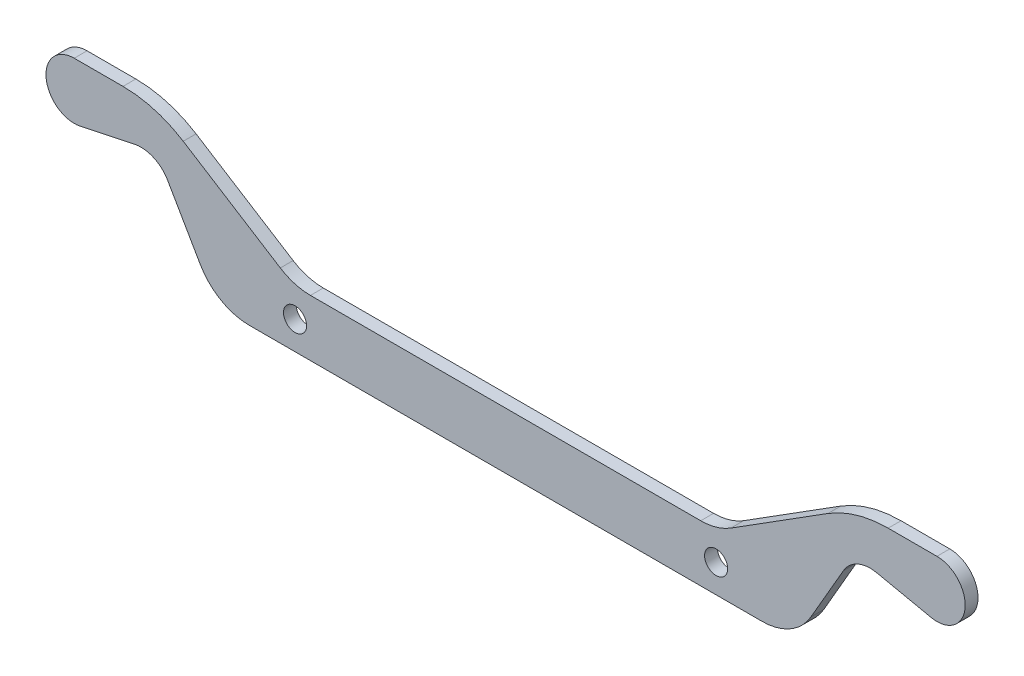
ISO-10303-21;
HEADER;
FILE_DESCRIPTION(('STEP AP214'),'2;1');
FILE_NAME('part.step','',(''),(''),'','','');
FILE_SCHEMA(('AUTOMOTIVE_DESIGN { 1 0 10303 214 1 1 1 1 }'));
ENDSEC;
DATA;
#1=APPLICATION_CONTEXT('core data for automotive mechanical design processes');
#2=APPLICATION_PROTOCOL_DEFINITION('international standard','automotive_design',2000,#1);
#3=PRODUCT_CONTEXT('',#1,'mechanical');
#4=PRODUCT('Part','Part','',(#3));
#5=PRODUCT_RELATED_PRODUCT_CATEGORY('part','',(#4));
#6=PRODUCT_DEFINITION_FORMATION('','',#4);
#7=PRODUCT_DEFINITION_CONTEXT('part definition',#1,'design');
#8=PRODUCT_DEFINITION('design','',#6,#7);
#9=PRODUCT_DEFINITION_SHAPE('','',#8);
#10=(LENGTH_UNIT() NAMED_UNIT(*) SI_UNIT(.MILLI.,.METRE.));
#11=(NAMED_UNIT(*) PLANE_ANGLE_UNIT() SI_UNIT($,.RADIAN.));
#12=(NAMED_UNIT(*) SI_UNIT($,.STERADIAN.) SOLID_ANGLE_UNIT());
#13=UNCERTAINTY_MEASURE_WITH_UNIT(LENGTH_MEASURE(1.E-05),#10,'distance_accuracy_value','');
#14=(GEOMETRIC_REPRESENTATION_CONTEXT(3) GLOBAL_UNCERTAINTY_ASSIGNED_CONTEXT((#13)) GLOBAL_UNIT_ASSIGNED_CONTEXT((#10,
#11,#12)) REPRESENTATION_CONTEXT('',''));
#15=CARTESIAN_POINT('',(0.,0.,0.));
#16=DIRECTION('',(0.,0.,1.));
#17=DIRECTION('',(1.,0.,0.));
#18=AXIS2_PLACEMENT_3D('',#15,#16,#17);
#19=CARTESIAN_POINT('',(-38.,22.,2.5));
#20=DIRECTION('',(0.,0.,1.));
#21=DIRECTION('',(1.,0.,0.));
#22=AXIS2_PLACEMENT_3D('',#19,#20,#21);
#23=PLANE('',#22);
#24=DIRECTION('',(1.,0.,0.));
#25=VECTOR('',#24,1.);
#26=CARTESIAN_POINT('',(0.,0.,2.5));
#27=LINE('',#26,#25);
#28=CARTESIAN_POINT('',(-49.9267151745786,0.,2.5));
#29=VERTEX_POINT('',#28);
#30=CARTESIAN_POINT('',(49.9267151745786,0.,2.5));
#31=VERTEX_POINT('',#30);
#32=EDGE_CURVE('E154',#29,#31,#27,.T.);
#33=ORIENTED_EDGE('',*,*,#32,.T.);
#34=CARTESIAN_POINT('',(49.9267151745787,11.,2.5));
#35=DIRECTION('',(0.,0.,-1.));
#36=DIRECTION('',(1.,0.,0.));
#37=AXIS2_PLACEMENT_3D('',#34,#35,#36);
#38=CIRCLE('',#37,11.);
#39=CARTESIAN_POINT('',(59.4529946162075,5.50000000000006,2.5));
#40=VERTEX_POINT('',#39);
#41=EDGE_CURVE('E307',#40,#31,#38,.T.);
#42=ORIENTED_EDGE('',*,*,#41,.F.);
#43=DIRECTION('',(-0.499999999999998,-0.86602540378444,0.));
#44=VECTOR('',#43,1.);
#45=CARTESIAN_POINT('',(59.4529946162075,5.50000000000006,2.5));
#46=LINE('',#45,#44);
#47=CARTESIAN_POINT('',(65.8038475772934,16.5,2.5));
#48=VERTEX_POINT('',#47);
#49=EDGE_CURVE('E349',#48,#40,#46,.T.);
#50=ORIENTED_EDGE('',*,*,#49,.F.);
#51=CARTESIAN_POINT('',(71.,13.5,2.5));
#52=DIRECTION('',(0.,0.,1.));
#53=DIRECTION('',(-1.,0.,0.));
#54=AXIS2_PLACEMENT_3D('',#51,#52,#53);
#55=CIRCLE('',#54,6.00000000000001);
#56=CARTESIAN_POINT('',(72.2444311583289,19.369530738669,2.5));
#57=VERTEX_POINT('',#56);
#58=EDGE_CURVE('E353',#57,#48,#55,.T.);
#59=ORIENTED_EDGE('',*,*,#58,.F.);
#60=DIRECTION('',(-0.9782551231115,0.207405193054813,0.));
#61=VECTOR('',#60,1.);
#62=CARTESIAN_POINT('',(82.8565539666262,17.1195968228868,2.5));
#63=LINE('',#62,#61);
#64=CARTESIAN_POINT('',(82.8565539666262,17.1195968228868,2.5));
#65=VERTEX_POINT('',#64);
#66=EDGE_CURVE('E357',#65,#57,#63,.T.);
#67=ORIENTED_EDGE('',*,*,#66,.F.);
#68=CARTESIAN_POINT('',(83.9972825284277,22.5,2.5));
#69=DIRECTION('',(0.,0.,-1.));
#70=DIRECTION('',(1.,0.,0.));
#71=AXIS2_PLACEMENT_3D('',#68,#69,#70);
#72=CIRCLE('',#71,5.5);
#73=CARTESIAN_POINT('',(83.9972825284277,28.,2.5));
#74=VERTEX_POINT('',#73);
#75=EDGE_CURVE('E361',#74,#65,#72,.T.);
#76=ORIENTED_EDGE('',*,*,#75,.F.);
#77=DIRECTION('',(1.,0.,0.));
#78=VECTOR('',#77,1.);
#79=CARTESIAN_POINT('',(83.9972825284277,28.,2.5));
#80=LINE('',#79,#78);
#81=CARTESIAN_POINT('',(74.5,28.,2.5));
#82=VERTEX_POINT('',#81);
#83=EDGE_CURVE('E365',#82,#74,#80,.T.);
#84=ORIENTED_EDGE('',*,*,#83,.F.);
#85=CARTESIAN_POINT('',(74.5,6.,2.5));
#86=DIRECTION('',(0.,0.,-1.));
#87=DIRECTION('',(-1.,0.,0.));
#88=AXIS2_PLACEMENT_3D('',#85,#86,#87);
#89=CIRCLE('',#88,22.);
#90=CARTESIAN_POINT('',(62.7676240176103,24.6105172901734,2.5));
#91=VERTEX_POINT('',#90);
#92=EDGE_CURVE('E369',#91,#82,#89,.T.);
#93=ORIENTED_EDGE('',*,*,#92,.F.);
#94=DIRECTION('',(0.845932604098793,0.533289817381351,0.));
#95=VECTOR('',#94,1.);
#96=CARTESIAN_POINT('',(43.8661879911949,12.6947413549133,2.5));
#97=LINE('',#96,#95);
#98=CARTESIAN_POINT('',(43.8661879911949,12.6947413549133,2.5));
#99=VERTEX_POINT('',#98);
#100=EDGE_CURVE('E373',#99,#91,#97,.T.);
#101=ORIENTED_EDGE('',*,*,#100,.F.);
#102=CARTESIAN_POINT('',(38.,22.,2.5));
#103=DIRECTION('',(0.,0.,1.));
#104=DIRECTION('',(-1.,0.,0.));
#105=AXIS2_PLACEMENT_3D('',#102,#103,#104);
#106=CIRCLE('',#105,11.);
#107=CARTESIAN_POINT('',(38.,11.,2.5));
#108=VERTEX_POINT('',#107);
#109=EDGE_CURVE('E312',#108,#99,#106,.T.);
#110=ORIENTED_EDGE('',*,*,#109,.F.);
#111=DIRECTION('',(-1.,0.,0.));
#112=VECTOR('',#111,1.);
#113=CARTESIAN_POINT('',(0.,11.,2.5));
#114=LINE('',#113,#112);
#115=CARTESIAN_POINT('',(-38.,11.,2.5));
#116=VERTEX_POINT('',#115);
#117=EDGE_CURVE('E107',#108,#116,#114,.T.);
#118=ORIENTED_EDGE('',*,*,#117,.T.);
#119=CARTESIAN_POINT('',(-38.,22.,2.5));
#120=DIRECTION('',(0.,0.,-1.));
#121=DIRECTION('',(1.,0.,0.));
#122=AXIS2_PLACEMENT_3D('',#119,#120,#121);
#123=CIRCLE('',#122,11.);
#124=CARTESIAN_POINT('',(-43.8661879911949,12.6947413549133,2.5));
#125=VERTEX_POINT('',#124);
#126=EDGE_CURVE('E255',#116,#125,#123,.T.);
#127=ORIENTED_EDGE('',*,*,#126,.T.);
#128=DIRECTION('',(-0.845932604098793,0.533289817381351,0.));
#129=VECTOR('',#128,1.);
#130=CARTESIAN_POINT('',(-43.8661879911949,12.6947413549133,2.5));
#131=LINE('',#130,#129);
#132=CARTESIAN_POINT('',(-62.7676240176103,24.6105172901734,2.5));
#133=VERTEX_POINT('',#132);
#134=EDGE_CURVE('E222',#125,#133,#131,.T.);
#135=ORIENTED_EDGE('',*,*,#134,.T.);
#136=CARTESIAN_POINT('',(-74.5,6.,2.5));
#137=DIRECTION('',(0.,0.,1.));
#138=DIRECTION('',(1.,0.,0.));
#139=AXIS2_PLACEMENT_3D('',#136,#137,#138);
#140=CIRCLE('',#139,22.);
#141=CARTESIAN_POINT('',(-74.5,28.,2.5));
#142=VERTEX_POINT('',#141);
#143=EDGE_CURVE('E245',#133,#142,#140,.T.);
#144=ORIENTED_EDGE('',*,*,#143,.T.);
#145=DIRECTION('',(-1.,0.,0.));
#146=VECTOR('',#145,1.);
#147=CARTESIAN_POINT('',(-83.9972825284277,28.,2.5));
#148=LINE('',#147,#146);
#149=CARTESIAN_POINT('',(-83.9972825284277,28.,2.5));
#150=VERTEX_POINT('',#149);
#151=EDGE_CURVE('E241',#142,#150,#148,.T.);
#152=ORIENTED_EDGE('',*,*,#151,.T.);
#153=CARTESIAN_POINT('',(-83.9972825284277,22.5,2.5));
#154=DIRECTION('',(0.,0.,1.));
#155=DIRECTION('',(-1.,0.,0.));
#156=AXIS2_PLACEMENT_3D('',#153,#154,#155);
#157=CIRCLE('',#156,5.5);
#158=CARTESIAN_POINT('',(-82.8565539666262,17.1195968228868,2.5));
#159=VERTEX_POINT('',#158);
#160=EDGE_CURVE('E244',#150,#159,#157,.T.);
#161=ORIENTED_EDGE('',*,*,#160,.T.);
#162=DIRECTION('',(0.9782551231115,0.207405193054813,0.));
#163=VECTOR('',#162,1.);
#164=CARTESIAN_POINT('',(-82.8565539666262,17.1195968228868,2.5));
#165=LINE('',#164,#163);
#166=CARTESIAN_POINT('',(-72.2444311583289,19.369530738669,2.5));
#167=VERTEX_POINT('',#166);
#168=EDGE_CURVE('E136',#159,#167,#165,.T.);
#169=ORIENTED_EDGE('',*,*,#168,.T.);
#170=CARTESIAN_POINT('',(-71.,13.5,2.5));
#171=DIRECTION('',(0.,0.,-1.));
#172=DIRECTION('',(1.,0.,0.));
#173=AXIS2_PLACEMENT_3D('',#170,#171,#172);
#174=CIRCLE('',#173,6.00000000000001);
#175=CARTESIAN_POINT('',(-65.8038475772934,16.5,2.5));
#176=VERTEX_POINT('',#175);
#177=EDGE_CURVE('E130',#167,#176,#174,.T.);
#178=ORIENTED_EDGE('',*,*,#177,.T.);
#179=DIRECTION('',(0.499999999999998,-0.86602540378444,0.));
#180=VECTOR('',#179,1.);
#181=CARTESIAN_POINT('',(-59.4529946162075,5.50000000000006,2.5));
#182=LINE('',#181,#180);
#183=CARTESIAN_POINT('',(-59.4529946162075,5.50000000000006,2.5));
#184=VERTEX_POINT('',#183);
#185=EDGE_CURVE('E134',#176,#184,#182,.T.);
#186=ORIENTED_EDGE('',*,*,#185,.T.);
#187=CARTESIAN_POINT('',(-49.9267151745787,11.,2.5));
#188=DIRECTION('',(0.,0.,1.));
#189=DIRECTION('',(-1.,0.,0.));
#190=AXIS2_PLACEMENT_3D('',#187,#188,#189);
#191=CIRCLE('',#190,11.);
#192=EDGE_CURVE('E57',#184,#29,#191,.T.);
#193=ORIENTED_EDGE('',*,*,#192,.T.);
#194=EDGE_LOOP('',(#33,#42,#50,#59,#67,#76,#84,#93,#101,#110,#118,#127,#135,#144,#152,#161,#169,
#178,#186,#193));
#195=FACE_BOUND('',#194,.T.);
#196=CARTESIAN_POINT('',(-41.,5.49999999999999,2.5));
#197=DIRECTION('',(0.,0.,1.));
#198=DIRECTION('',(1.,0.,0.));
#199=AXIS2_PLACEMENT_3D('',#196,#197,#198);
#200=CIRCLE('',#199,2.25);
#201=CARTESIAN_POINT('',(-38.75,5.49999999999999,2.5));
#202=VERTEX_POINT('',#201);
#203=EDGE_CURVE('E165',#202,#202,#200,.T.);
#204=ORIENTED_EDGE('',*,*,#203,.F.);
#205=EDGE_LOOP('',(#204));
#206=FACE_BOUND('',#205,.T.);
#207=CARTESIAN_POINT('',(41.,5.49999999999999,2.5));
#208=DIRECTION('',(0.,0.,-1.));
#209=DIRECTION('',(-1.,0.,0.));
#210=AXIS2_PLACEMENT_3D('',#207,#208,#209);
#211=CIRCLE('',#210,2.25);
#212=CARTESIAN_POINT('',(38.75,5.49999999999999,2.5));
#213=VERTEX_POINT('',#212);
#214=EDGE_CURVE('E345',#213,#213,#211,.T.);
#215=ORIENTED_EDGE('',*,*,#214,.T.);
#216=EDGE_LOOP('',(#215));
#217=FACE_BOUND('',#216,.T.);
#218=ADVANCED_FACE('F39',(#195,#206,#217),#23,.T.);
#219=CARTESIAN_POINT('',(-38.,22.,0.));
#220=DIRECTION('',(0.,0.,1.));
#221=DIRECTION('',(1.,0.,0.));
#222=AXIS2_PLACEMENT_3D('',#219,#220,#221);
#223=PLANE('',#222);
#224=DIRECTION('',(-1.,0.,0.));
#225=VECTOR('',#224,1.);
#226=CARTESIAN_POINT('',(0.,11.,0.));
#227=LINE('',#226,#225);
#228=CARTESIAN_POINT('',(38.,11.,0.));
#229=VERTEX_POINT('',#228);
#230=CARTESIAN_POINT('',(-38.,11.,0.));
#231=VERTEX_POINT('',#230);
#232=EDGE_CURVE('E161',#229,#231,#227,.T.);
#233=ORIENTED_EDGE('',*,*,#232,.F.);
#234=CARTESIAN_POINT('',(38.,22.,0.));
#235=DIRECTION('',(0.,0.,1.));
#236=DIRECTION('',(-1.,0.,0.));
#237=AXIS2_PLACEMENT_3D('',#234,#235,#236);
#238=CIRCLE('',#237,11.);
#239=CARTESIAN_POINT('',(43.8661879911949,12.6947413549133,0.));
#240=VERTEX_POINT('',#239);
#241=EDGE_CURVE('E341',#229,#240,#238,.T.);
#242=ORIENTED_EDGE('',*,*,#241,.T.);
#243=DIRECTION('',(0.845932604098793,0.533289817381351,0.));
#244=VECTOR('',#243,1.);
#245=CARTESIAN_POINT('',(43.8661879911949,12.6947413549133,0.));
#246=LINE('',#245,#244);
#247=CARTESIAN_POINT('',(62.7676240176103,24.6105172901734,0.));
#248=VERTEX_POINT('',#247);
#249=EDGE_CURVE('E337',#240,#248,#246,.T.);
#250=ORIENTED_EDGE('',*,*,#249,.T.);
#251=CARTESIAN_POINT('',(74.5,6.,0.));
#252=DIRECTION('',(0.,0.,-1.));
#253=DIRECTION('',(-1.,0.,0.));
#254=AXIS2_PLACEMENT_3D('',#251,#252,#253);
#255=CIRCLE('',#254,22.);
#256=CARTESIAN_POINT('',(74.5,28.,0.));
#257=VERTEX_POINT('',#256);
#258=EDGE_CURVE('E333',#248,#257,#255,.T.);
#259=ORIENTED_EDGE('',*,*,#258,.T.);
#260=DIRECTION('',(1.,0.,0.));
#261=VECTOR('',#260,1.);
#262=CARTESIAN_POINT('',(83.9972825284277,28.,0.));
#263=LINE('',#262,#261);
#264=CARTESIAN_POINT('',(83.9972825284277,28.,0.));
#265=VERTEX_POINT('',#264);
#266=EDGE_CURVE('E329',#257,#265,#263,.T.);
#267=ORIENTED_EDGE('',*,*,#266,.T.);
#268=CARTESIAN_POINT('',(83.9972825284277,22.5,0.));
#269=DIRECTION('',(0.,0.,-1.));
#270=DIRECTION('',(1.,0.,0.));
#271=AXIS2_PLACEMENT_3D('',#268,#269,#270);
#272=CIRCLE('',#271,5.5);
#273=CARTESIAN_POINT('',(82.8565539666262,17.1195968228868,0.));
#274=VERTEX_POINT('',#273);
#275=EDGE_CURVE('E325',#265,#274,#272,.T.);
#276=ORIENTED_EDGE('',*,*,#275,.T.);
#277=DIRECTION('',(-0.9782551231115,0.207405193054813,0.));
#278=VECTOR('',#277,1.);
#279=CARTESIAN_POINT('',(82.8565539666262,17.1195968228868,0.));
#280=LINE('',#279,#278);
#281=CARTESIAN_POINT('',(72.2444311583289,19.369530738669,0.));
#282=VERTEX_POINT('',#281);
#283=EDGE_CURVE('E321',#274,#282,#280,.T.);
#284=ORIENTED_EDGE('',*,*,#283,.T.);
#285=CARTESIAN_POINT('',(71.,13.5,0.));
#286=DIRECTION('',(0.,0.,1.));
#287=DIRECTION('',(-1.,0.,0.));
#288=AXIS2_PLACEMENT_3D('',#285,#286,#287);
#289=CIRCLE('',#288,6.00000000000001);
#290=CARTESIAN_POINT('',(65.8038475772934,16.5,0.));
#291=VERTEX_POINT('',#290);
#292=EDGE_CURVE('E317',#282,#291,#289,.T.);
#293=ORIENTED_EDGE('',*,*,#292,.T.);
#294=DIRECTION('',(-0.499999999999998,-0.86602540378444,0.));
#295=VECTOR('',#294,1.);
#296=CARTESIAN_POINT('',(59.4529946162075,5.50000000000006,0.));
#297=LINE('',#296,#295);
#298=CARTESIAN_POINT('',(59.4529946162075,5.50000000000006,0.));
#299=VERTEX_POINT('',#298);
#300=EDGE_CURVE('E313',#291,#299,#297,.T.);
#301=ORIENTED_EDGE('',*,*,#300,.T.);
#302=CARTESIAN_POINT('',(49.9267151745787,11.,0.));
#303=DIRECTION('',(0.,0.,-1.));
#304=DIRECTION('',(1.,0.,0.));
#305=AXIS2_PLACEMENT_3D('',#302,#303,#304);
#306=CIRCLE('',#305,11.);
#307=CARTESIAN_POINT('',(49.9267151745786,0.,0.));
#308=VERTEX_POINT('',#307);
#309=EDGE_CURVE('E308',#299,#308,#306,.T.);
#310=ORIENTED_EDGE('',*,*,#309,.T.);
#311=DIRECTION('',(1.,0.,0.));
#312=VECTOR('',#311,1.);
#313=CARTESIAN_POINT('',(0.,0.,0.));
#314=LINE('',#313,#312);
#315=CARTESIAN_POINT('',(-49.9267151745786,0.,0.));
#316=VERTEX_POINT('',#315);
#317=EDGE_CURVE('E189',#316,#308,#314,.T.);
#318=ORIENTED_EDGE('',*,*,#317,.F.);
#319=CARTESIAN_POINT('',(-49.9267151745787,11.,0.));
#320=DIRECTION('',(0.,0.,1.));
#321=DIRECTION('',(-1.,0.,0.));
#322=AXIS2_PLACEMENT_3D('',#319,#320,#321);
#323=CIRCLE('',#322,11.);
#324=CARTESIAN_POINT('',(-59.4529946162075,5.50000000000006,0.));
#325=VERTEX_POINT('',#324);
#326=EDGE_CURVE('E99',#325,#316,#323,.T.);
#327=ORIENTED_EDGE('',*,*,#326,.F.);
#328=DIRECTION('',(0.499999999999998,-0.86602540378444,0.));
#329=VECTOR('',#328,1.);
#330=CARTESIAN_POINT('',(-59.4529946162075,5.50000000000006,0.));
#331=LINE('',#330,#329);
#332=CARTESIAN_POINT('',(-65.8038475772934,16.5,0.));
#333=VERTEX_POINT('',#332);
#334=EDGE_CURVE('E93',#333,#325,#331,.T.);
#335=ORIENTED_EDGE('',*,*,#334,.F.);
#336=CARTESIAN_POINT('',(-71.,13.5,0.));
#337=DIRECTION('',(0.,0.,-1.));
#338=DIRECTION('',(1.,0.,0.));
#339=AXIS2_PLACEMENT_3D('',#336,#337,#338);
#340=CIRCLE('',#339,6.00000000000001);
#341=CARTESIAN_POINT('',(-72.2444311583289,19.369530738669,0.));
#342=VERTEX_POINT('',#341);
#343=EDGE_CURVE('E145',#342,#333,#340,.T.);
#344=ORIENTED_EDGE('',*,*,#343,.F.);
#345=DIRECTION('',(0.9782551231115,0.207405193054813,0.));
#346=VECTOR('',#345,1.);
#347=CARTESIAN_POINT('',(-82.8565539666262,17.1195968228868,0.));
#348=LINE('',#347,#346);
#349=CARTESIAN_POINT('',(-82.8565539666262,17.1195968228868,0.));
#350=VERTEX_POINT('',#349);
#351=EDGE_CURVE('E180',#350,#342,#348,.T.);
#352=ORIENTED_EDGE('',*,*,#351,.F.);
#353=CARTESIAN_POINT('',(-83.9972825284277,22.5,0.));
#354=DIRECTION('',(0.,0.,1.));
#355=DIRECTION('',(-1.,0.,0.));
#356=AXIS2_PLACEMENT_3D('',#353,#354,#355);
#357=CIRCLE('',#356,5.5);
#358=CARTESIAN_POINT('',(-83.9972825284277,28.,0.));
#359=VERTEX_POINT('',#358);
#360=EDGE_CURVE('E177',#359,#350,#357,.T.);
#361=ORIENTED_EDGE('',*,*,#360,.F.);
#362=DIRECTION('',(-1.,0.,0.));
#363=VECTOR('',#362,1.);
#364=CARTESIAN_POINT('',(-83.9972825284277,28.,0.));
#365=LINE('',#364,#363);
#366=CARTESIAN_POINT('',(-74.5,28.,0.));
#367=VERTEX_POINT('',#366);
#368=EDGE_CURVE('E174',#367,#359,#365,.T.);
#369=ORIENTED_EDGE('',*,*,#368,.F.);
#370=CARTESIAN_POINT('',(-74.5,6.,0.));
#371=DIRECTION('',(0.,0.,1.));
#372=DIRECTION('',(1.,0.,0.));
#373=AXIS2_PLACEMENT_3D('',#370,#371,#372);
#374=CIRCLE('',#373,22.);
#375=CARTESIAN_POINT('',(-62.7676240176103,24.6105172901734,0.));
#376=VERTEX_POINT('',#375);
#377=EDGE_CURVE('E171',#376,#367,#374,.T.);
#378=ORIENTED_EDGE('',*,*,#377,.F.);
#379=DIRECTION('',(-0.845932604098793,0.533289817381351,0.));
#380=VECTOR('',#379,1.);
#381=CARTESIAN_POINT('',(-43.8661879911949,12.6947413549133,0.));
#382=LINE('',#381,#380);
#383=CARTESIAN_POINT('',(-43.8661879911949,12.6947413549133,0.));
#384=VERTEX_POINT('',#383);
#385=EDGE_CURVE('E168',#384,#376,#382,.T.);
#386=ORIENTED_EDGE('',*,*,#385,.F.);
#387=CARTESIAN_POINT('',(-38.,22.,0.));
#388=DIRECTION('',(0.,0.,-1.));
#389=DIRECTION('',(1.,0.,0.));
#390=AXIS2_PLACEMENT_3D('',#387,#388,#389);
#391=CIRCLE('',#390,11.);
#392=EDGE_CURVE('E164',#231,#384,#391,.T.);
#393=ORIENTED_EDGE('',*,*,#392,.F.);
#394=EDGE_LOOP('',(#233,#242,#250,#259,#267,#276,#284,#293,#301,#310,#318,#327,#335,#344,#352,
#361,#369,#378,#386,#393));
#395=FACE_BOUND('',#394,.T.);
#396=CARTESIAN_POINT('',(-41.,5.49999999999999,0.));
#397=DIRECTION('',(0.,0.,1.));
#398=DIRECTION('',(1.,0.,0.));
#399=AXIS2_PLACEMENT_3D('',#396,#397,#398);
#400=CIRCLE('',#399,2.25);
#401=CARTESIAN_POINT('',(-38.75,5.49999999999999,0.));
#402=VERTEX_POINT('',#401);
#403=EDGE_CURVE('E260',#402,#402,#400,.T.);
#404=ORIENTED_EDGE('',*,*,#403,.T.);
#405=EDGE_LOOP('',(#404));
#406=FACE_BOUND('',#405,.T.);
#407=CARTESIAN_POINT('',(41.,5.49999999999999,0.));
#408=DIRECTION('',(0.,0.,-1.));
#409=DIRECTION('',(-1.,0.,0.));
#410=AXIS2_PLACEMENT_3D('',#407,#408,#409);
#411=CIRCLE('',#410,2.25);
#412=CARTESIAN_POINT('',(38.75,5.49999999999999,0.));
#413=VERTEX_POINT('',#412);
#414=EDGE_CURVE('E380',#413,#413,#411,.T.);
#415=ORIENTED_EDGE('',*,*,#414,.F.);
#416=EDGE_LOOP('',(#415));
#417=FACE_BOUND('',#416,.T.);
#418=ADVANCED_FACE('F229',(#395,#406,#417),#223,.F.);
#419=CARTESIAN_POINT('',(0.,11.,2.5));
#420=DIRECTION('',(0.,-1.,0.));
#421=DIRECTION('',(1.,0.,0.));
#422=AXIS2_PLACEMENT_3D('',#419,#420,#421);
#423=PLANE('',#422);
#424=ORIENTED_EDGE('',*,*,#232,.T.);
#425=DIRECTION('',(0.,0.,-1.));
#426=VECTOR('',#425,1.);
#427=CARTESIAN_POINT('',(-38.,11.,2.5));
#428=LINE('',#427,#426);
#429=EDGE_CURVE('E11',#116,#231,#428,.T.);
#430=ORIENTED_EDGE('',*,*,#429,.F.);
#431=ORIENTED_EDGE('',*,*,#117,.F.);
#432=DIRECTION('',(0.,0.,-1.));
#433=VECTOR('',#432,1.);
#434=CARTESIAN_POINT('',(38.,11.,2.5));
#435=LINE('',#434,#433);
#436=EDGE_CURVE('E264',#108,#229,#435,.T.);
#437=ORIENTED_EDGE('',*,*,#436,.T.);
#438=EDGE_LOOP('',(#424,#430,#431,#437));
#439=FACE_BOUND('',#438,.T.);
#440=ADVANCED_FACE('F41',(#439),#423,.F.);
#441=CARTESIAN_POINT('',(-38.,22.,2.5));
#442=DIRECTION('',(0.,0.,-1.));
#443=DIRECTION('',(-1.,0.,0.));
#444=AXIS2_PLACEMENT_3D('',#441,#442,#443);
#445=CYLINDRICAL_SURFACE('',#444,11.);
#446=ORIENTED_EDGE('',*,*,#392,.T.);
#447=DIRECTION('',(0.,0.,-1.));
#448=VECTOR('',#447,1.);
#449=CARTESIAN_POINT('',(-43.8661879911949,12.6947413549133,2.5));
#450=LINE('',#449,#448);
#451=EDGE_CURVE('E49',#125,#384,#450,.T.);
#452=ORIENTED_EDGE('',*,*,#451,.F.);
#453=ORIENTED_EDGE('',*,*,#126,.F.);
#454=ORIENTED_EDGE('',*,*,#429,.T.);
#455=EDGE_LOOP('',(#446,#452,#453,#454));
#456=FACE_BOUND('',#455,.T.);
#457=ADVANCED_FACE('F402',(#456),#445,.F.);
#458=CARTESIAN_POINT('',(-43.8661879911949,12.6947413549133,2.5));
#459=DIRECTION('',(-0.533289817381351,-0.845932604098793,0.));
#460=DIRECTION('',(0.845932604098793,-0.533289817381351,0.));
#461=AXIS2_PLACEMENT_3D('',#458,#459,#460);
#462=PLANE('',#461);
#463=ORIENTED_EDGE('',*,*,#385,.T.);
#464=DIRECTION('',(0.,0.,-1.));
#465=VECTOR('',#464,1.);
#466=CARTESIAN_POINT('',(-62.7676240176103,24.6105172901734,2.5));
#467=LINE('',#466,#465);
#468=EDGE_CURVE('E211',#133,#376,#467,.T.);
#469=ORIENTED_EDGE('',*,*,#468,.F.);
#470=ORIENTED_EDGE('',*,*,#134,.F.);
#471=ORIENTED_EDGE('',*,*,#451,.T.);
#472=EDGE_LOOP('',(#463,#469,#470,#471));
#473=FACE_BOUND('',#472,.T.);
#474=ADVANCED_FACE('F220',(#473),#462,.F.);
#475=CARTESIAN_POINT('',(-74.5,6.,2.5));
#476=DIRECTION('',(0.,0.,-1.));
#477=DIRECTION('',(-1.,0.,0.));
#478=AXIS2_PLACEMENT_3D('',#475,#476,#477);
#479=CYLINDRICAL_SURFACE('',#478,22.);
#480=ORIENTED_EDGE('',*,*,#377,.T.);
#481=DIRECTION('',(0.,0.,-1.));
#482=VECTOR('',#481,1.);
#483=CARTESIAN_POINT('',(-74.5,28.,2.5));
#484=LINE('',#483,#482);
#485=EDGE_CURVE('E207',#142,#367,#484,.T.);
#486=ORIENTED_EDGE('',*,*,#485,.F.);
#487=ORIENTED_EDGE('',*,*,#143,.F.);
#488=ORIENTED_EDGE('',*,*,#468,.T.);
#489=EDGE_LOOP('',(#480,#486,#487,#488));
#490=FACE_BOUND('',#489,.T.);
#491=ADVANCED_FACE('F235',(#490),#479,.T.);
#492=CARTESIAN_POINT('',(-83.9972825284277,28.,2.5));
#493=DIRECTION('',(0.,-1.,0.));
#494=DIRECTION('',(0.,0.,-1.));
#495=AXIS2_PLACEMENT_3D('',#492,#493,#494);
#496=PLANE('',#495);
#497=ORIENTED_EDGE('',*,*,#368,.T.);
#498=DIRECTION('',(0.,0.,-1.));
#499=VECTOR('',#498,1.);
#500=CARTESIAN_POINT('',(-83.9972825284277,28.,2.5));
#501=LINE('',#500,#499);
#502=EDGE_CURVE('E203',#150,#359,#501,.T.);
#503=ORIENTED_EDGE('',*,*,#502,.F.);
#504=ORIENTED_EDGE('',*,*,#151,.F.);
#505=ORIENTED_EDGE('',*,*,#485,.T.);
#506=EDGE_LOOP('',(#497,#503,#504,#505));
#507=FACE_BOUND('',#506,.T.);
#508=ADVANCED_FACE('F239',(#507),#496,.F.);
#509=CARTESIAN_POINT('',(-83.9972825284277,22.5,2.5));
#510=DIRECTION('',(0.,0.,-1.));
#511=DIRECTION('',(-1.,0.,0.));
#512=AXIS2_PLACEMENT_3D('',#509,#510,#511);
#513=CYLINDRICAL_SURFACE('',#512,5.5);
#514=ORIENTED_EDGE('',*,*,#360,.T.);
#515=DIRECTION('',(0.,0.,-1.));
#516=VECTOR('',#515,1.);
#517=CARTESIAN_POINT('',(-82.8565539666262,17.1195968228868,2.5));
#518=LINE('',#517,#516);
#519=EDGE_CURVE('E199',#159,#350,#518,.T.);
#520=ORIENTED_EDGE('',*,*,#519,.F.);
#521=ORIENTED_EDGE('',*,*,#160,.F.);
#522=ORIENTED_EDGE('',*,*,#502,.T.);
#523=EDGE_LOOP('',(#514,#520,#521,#522));
#524=FACE_BOUND('',#523,.T.);
#525=ADVANCED_FACE('F422',(#524),#513,.T.);
#526=CARTESIAN_POINT('',(-82.8565539666262,17.1195968228868,2.5));
#527=DIRECTION('',(-0.207405193054813,0.9782551231115,0.));
#528=DIRECTION('',(-0.9782551231115,-0.207405193054813,0.));
#529=AXIS2_PLACEMENT_3D('',#526,#527,#528);
#530=PLANE('',#529);
#531=ORIENTED_EDGE('',*,*,#351,.T.);
#532=DIRECTION('',(0.,0.,-1.));
#533=VECTOR('',#532,1.);
#534=CARTESIAN_POINT('',(-72.2444311583289,19.369530738669,2.5));
#535=LINE('',#534,#533);
#536=EDGE_CURVE('E147',#167,#342,#535,.T.);
#537=ORIENTED_EDGE('',*,*,#536,.F.);
#538=ORIENTED_EDGE('',*,*,#168,.F.);
#539=ORIENTED_EDGE('',*,*,#519,.T.);
#540=EDGE_LOOP('',(#531,#537,#538,#539));
#541=FACE_BOUND('',#540,.T.);
#542=ADVANCED_FACE('F419',(#541),#530,.F.);
#543=CARTESIAN_POINT('',(-71.,13.5,2.5));
#544=DIRECTION('',(0.,0.,-1.));
#545=DIRECTION('',(-1.,0.,0.));
#546=AXIS2_PLACEMENT_3D('',#543,#544,#545);
#547=CYLINDRICAL_SURFACE('',#546,6.00000000000001);
#548=ORIENTED_EDGE('',*,*,#343,.T.);
#549=DIRECTION('',(0.,0.,-1.));
#550=VECTOR('',#549,1.);
#551=CARTESIAN_POINT('',(-65.8038475772934,16.5,2.5));
#552=LINE('',#551,#550);
#553=EDGE_CURVE('E142',#176,#333,#552,.T.);
#554=ORIENTED_EDGE('',*,*,#553,.F.);
#555=ORIENTED_EDGE('',*,*,#177,.F.);
#556=ORIENTED_EDGE('',*,*,#536,.T.);
#557=EDGE_LOOP('',(#548,#554,#555,#556));
#558=FACE_BOUND('',#557,.T.);
#559=ADVANCED_FACE('F143',(#558),#547,.F.);
#560=CARTESIAN_POINT('',(-59.4529946162075,5.50000000000006,2.5));
#561=DIRECTION('',(0.86602540378444,0.499999999999998,0.));
#562=DIRECTION('',(-0.499999999999998,0.86602540378444,0.));
#563=AXIS2_PLACEMENT_3D('',#560,#561,#562);
#564=PLANE('',#563);
#565=ORIENTED_EDGE('',*,*,#334,.T.);
#566=DIRECTION('',(0.,0.,-1.));
#567=VECTOR('',#566,1.);
#568=CARTESIAN_POINT('',(-59.4529946162075,5.50000000000006,2.5));
#569=LINE('',#568,#567);
#570=EDGE_CURVE('E148',#184,#325,#569,.T.);
#571=ORIENTED_EDGE('',*,*,#570,.F.);
#572=ORIENTED_EDGE('',*,*,#185,.F.);
#573=ORIENTED_EDGE('',*,*,#553,.T.);
#574=EDGE_LOOP('',(#565,#571,#572,#573));
#575=FACE_BOUND('',#574,.T.);
#576=ADVANCED_FACE('F150',(#575),#564,.F.);
#577=CARTESIAN_POINT('',(-49.9267151745787,11.,2.5));
#578=DIRECTION('',(0.,0.,-1.));
#579=DIRECTION('',(-1.,0.,0.));
#580=AXIS2_PLACEMENT_3D('',#577,#578,#579);
#581=CYLINDRICAL_SURFACE('',#580,11.);
#582=ORIENTED_EDGE('',*,*,#326,.T.);
#583=DIRECTION('',(0.,0.,-1.));
#584=VECTOR('',#583,1.);
#585=CARTESIAN_POINT('',(-49.9267151745786,0.,2.5));
#586=LINE('',#585,#584);
#587=EDGE_CURVE('E160',#29,#316,#586,.T.);
#588=ORIENTED_EDGE('',*,*,#587,.F.);
#589=ORIENTED_EDGE('',*,*,#192,.F.);
#590=ORIENTED_EDGE('',*,*,#570,.T.);
#591=EDGE_LOOP('',(#582,#588,#589,#590));
#592=FACE_BOUND('',#591,.T.);
#593=ADVANCED_FACE('F411',(#592),#581,.T.);
#594=CARTESIAN_POINT('',(0.,0.,2.5));
#595=DIRECTION('',(0.,1.,0.));
#596=DIRECTION('',(-1.,0.,0.));
#597=AXIS2_PLACEMENT_3D('',#594,#595,#596);
#598=PLANE('',#597);
#599=ORIENTED_EDGE('',*,*,#317,.T.);
#600=DIRECTION('',(0.,0.,-1.));
#601=VECTOR('',#600,1.);
#602=CARTESIAN_POINT('',(49.9267151745786,0.,2.5));
#603=LINE('',#602,#601);
#604=EDGE_CURVE('E303',#31,#308,#603,.T.);
#605=ORIENTED_EDGE('',*,*,#604,.F.);
#606=ORIENTED_EDGE('',*,*,#32,.F.);
#607=ORIENTED_EDGE('',*,*,#587,.T.);
#608=EDGE_LOOP('',(#599,#605,#606,#607));
#609=FACE_BOUND('',#608,.T.);
#610=ADVANCED_FACE('F407',(#609),#598,.F.);
#611=CARTESIAN_POINT('',(-41.,5.49999999999999,2.5));
#612=DIRECTION('',(0.,0.,-1.));
#613=DIRECTION('',(-1.,0.,0.));
#614=AXIS2_PLACEMENT_3D('',#611,#612,#613);
#615=CYLINDRICAL_SURFACE('',#614,2.25);
#616=ORIENTED_EDGE('',*,*,#203,.T.);
#617=EDGE_LOOP('',(#616));
#618=FACE_BOUND('',#617,.T.);
#619=ORIENTED_EDGE('',*,*,#403,.F.);
#620=EDGE_LOOP('',(#619));
#621=FACE_BOUND('',#620,.T.);
#622=ADVANCED_FACE('F410',(#618,#621),#615,.F.);
#623=CARTESIAN_POINT('',(38.,22.,2.5));
#624=DIRECTION('',(0.,0.,-1.));
#625=DIRECTION('',(1.,0.,0.));
#626=AXIS2_PLACEMENT_3D('',#623,#624,#625);
#627=CYLINDRICAL_SURFACE('',#626,11.);
#628=ORIENTED_EDGE('',*,*,#241,.F.);
#629=ORIENTED_EDGE('',*,*,#436,.F.);
#630=ORIENTED_EDGE('',*,*,#109,.T.);
#631=DIRECTION('',(0.,0.,-1.));
#632=VECTOR('',#631,1.);
#633=CARTESIAN_POINT('',(43.8661879911949,12.6947413549133,2.5));
#634=LINE('',#633,#632);
#635=EDGE_CURVE('E271',#99,#240,#634,.T.);
#636=ORIENTED_EDGE('',*,*,#635,.T.);
#637=EDGE_LOOP('',(#628,#629,#630,#636));
#638=FACE_BOUND('',#637,.T.);
#639=ADVANCED_FACE('F521',(#638),#627,.F.);
#640=CARTESIAN_POINT('',(43.8661879911949,12.6947413549133,2.5));
#641=DIRECTION('',(0.533289817381351,-0.845932604098793,0.));
#642=DIRECTION('',(-0.845932604098793,-0.533289817381351,0.));
#643=AXIS2_PLACEMENT_3D('',#640,#641,#642);
#644=PLANE('',#643);
#645=ORIENTED_EDGE('',*,*,#249,.F.);
#646=ORIENTED_EDGE('',*,*,#635,.F.);
#647=ORIENTED_EDGE('',*,*,#100,.T.);
#648=DIRECTION('',(0.,0.,-1.));
#649=VECTOR('',#648,1.);
#650=CARTESIAN_POINT('',(62.7676240176103,24.6105172901734,2.5));
#651=LINE('',#650,#649);
#652=EDGE_CURVE('E275',#91,#248,#651,.T.);
#653=ORIENTED_EDGE('',*,*,#652,.T.);
#654=EDGE_LOOP('',(#645,#646,#647,#653));
#655=FACE_BOUND('',#654,.T.);
#656=ADVANCED_FACE('F517',(#655),#644,.F.);
#657=CARTESIAN_POINT('',(74.5,6.,2.5));
#658=DIRECTION('',(0.,0.,-1.));
#659=DIRECTION('',(1.,0.,0.));
#660=AXIS2_PLACEMENT_3D('',#657,#658,#659);
#661=CYLINDRICAL_SURFACE('',#660,22.);
#662=ORIENTED_EDGE('',*,*,#258,.F.);
#663=ORIENTED_EDGE('',*,*,#652,.F.);
#664=ORIENTED_EDGE('',*,*,#92,.T.);
#665=DIRECTION('',(0.,0.,-1.));
#666=VECTOR('',#665,1.);
#667=CARTESIAN_POINT('',(74.5,28.,2.5));
#668=LINE('',#667,#666);
#669=EDGE_CURVE('E279',#82,#257,#668,.T.);
#670=ORIENTED_EDGE('',*,*,#669,.T.);
#671=EDGE_LOOP('',(#662,#663,#664,#670));
#672=FACE_BOUND('',#671,.T.);
#673=ADVANCED_FACE('F513',(#672),#661,.T.);
#674=CARTESIAN_POINT('',(83.9972825284277,28.,2.5));
#675=DIRECTION('',(0.,-1.,0.));
#676=DIRECTION('',(0.,0.,-1.));
#677=AXIS2_PLACEMENT_3D('',#674,#675,#676);
#678=PLANE('',#677);
#679=ORIENTED_EDGE('',*,*,#266,.F.);
#680=ORIENTED_EDGE('',*,*,#669,.F.);
#681=ORIENTED_EDGE('',*,*,#83,.T.);
#682=DIRECTION('',(0.,0.,-1.));
#683=VECTOR('',#682,1.);
#684=CARTESIAN_POINT('',(83.9972825284277,28.,2.5));
#685=LINE('',#684,#683);
#686=EDGE_CURVE('E283',#74,#265,#685,.T.);
#687=ORIENTED_EDGE('',*,*,#686,.T.);
#688=EDGE_LOOP('',(#679,#680,#681,#687));
#689=FACE_BOUND('',#688,.T.);
#690=ADVANCED_FACE('F509',(#689),#678,.F.);
#691=CARTESIAN_POINT('',(83.9972825284277,22.5,2.5));
#692=DIRECTION('',(0.,0.,-1.));
#693=DIRECTION('',(1.,0.,0.));
#694=AXIS2_PLACEMENT_3D('',#691,#692,#693);
#695=CYLINDRICAL_SURFACE('',#694,5.5);
#696=ORIENTED_EDGE('',*,*,#275,.F.);
#697=ORIENTED_EDGE('',*,*,#686,.F.);
#698=ORIENTED_EDGE('',*,*,#75,.T.);
#699=DIRECTION('',(0.,0.,-1.));
#700=VECTOR('',#699,1.);
#701=CARTESIAN_POINT('',(82.8565539666262,17.1195968228868,2.5));
#702=LINE('',#701,#700);
#703=EDGE_CURVE('E287',#65,#274,#702,.T.);
#704=ORIENTED_EDGE('',*,*,#703,.T.);
#705=EDGE_LOOP('',(#696,#697,#698,#704));
#706=FACE_BOUND('',#705,.T.);
#707=ADVANCED_FACE('F505',(#706),#695,.T.);
#708=CARTESIAN_POINT('',(82.8565539666262,17.1195968228868,2.5));
#709=DIRECTION('',(0.207405193054813,0.9782551231115,0.));
#710=DIRECTION('',(0.9782551231115,-0.207405193054813,0.));
#711=AXIS2_PLACEMENT_3D('',#708,#709,#710);
#712=PLANE('',#711);
#713=ORIENTED_EDGE('',*,*,#283,.F.);
#714=ORIENTED_EDGE('',*,*,#703,.F.);
#715=ORIENTED_EDGE('',*,*,#66,.T.);
#716=DIRECTION('',(0.,0.,-1.));
#717=VECTOR('',#716,1.);
#718=CARTESIAN_POINT('',(72.2444311583289,19.369530738669,2.5));
#719=LINE('',#718,#717);
#720=EDGE_CURVE('E291',#57,#282,#719,.T.);
#721=ORIENTED_EDGE('',*,*,#720,.T.);
#722=EDGE_LOOP('',(#713,#714,#715,#721));
#723=FACE_BOUND('',#722,.T.);
#724=ADVANCED_FACE('F501',(#723),#712,.F.);
#725=CARTESIAN_POINT('',(71.,13.5,2.5));
#726=DIRECTION('',(0.,0.,-1.));
#727=DIRECTION('',(1.,0.,0.));
#728=AXIS2_PLACEMENT_3D('',#725,#726,#727);
#729=CYLINDRICAL_SURFACE('',#728,6.00000000000001);
#730=ORIENTED_EDGE('',*,*,#292,.F.);
#731=ORIENTED_EDGE('',*,*,#720,.F.);
#732=ORIENTED_EDGE('',*,*,#58,.T.);
#733=DIRECTION('',(0.,0.,-1.));
#734=VECTOR('',#733,1.);
#735=CARTESIAN_POINT('',(65.8038475772934,16.5,2.5));
#736=LINE('',#735,#734);
#737=EDGE_CURVE('E295',#48,#291,#736,.T.);
#738=ORIENTED_EDGE('',*,*,#737,.T.);
#739=EDGE_LOOP('',(#730,#731,#732,#738));
#740=FACE_BOUND('',#739,.T.);
#741=ADVANCED_FACE('F496',(#740),#729,.F.);
#742=CARTESIAN_POINT('',(59.4529946162075,5.50000000000006,2.5));
#743=DIRECTION('',(-0.86602540378444,0.499999999999998,0.));
#744=DIRECTION('',(0.499999999999998,0.86602540378444,0.));
#745=AXIS2_PLACEMENT_3D('',#742,#743,#744);
#746=PLANE('',#745);
#747=ORIENTED_EDGE('',*,*,#300,.F.);
#748=ORIENTED_EDGE('',*,*,#737,.F.);
#749=ORIENTED_EDGE('',*,*,#49,.T.);
#750=DIRECTION('',(0.,0.,-1.));
#751=VECTOR('',#750,1.);
#752=CARTESIAN_POINT('',(59.4529946162075,5.50000000000006,2.5));
#753=LINE('',#752,#751);
#754=EDGE_CURVE('E299',#40,#299,#753,.T.);
#755=ORIENTED_EDGE('',*,*,#754,.T.);
#756=EDGE_LOOP('',(#747,#748,#749,#755));
#757=FACE_BOUND('',#756,.T.);
#758=ADVANCED_FACE('F491',(#757),#746,.F.);
#759=CARTESIAN_POINT('',(49.9267151745787,11.,2.5));
#760=DIRECTION('',(0.,0.,-1.));
#761=DIRECTION('',(1.,0.,0.));
#762=AXIS2_PLACEMENT_3D('',#759,#760,#761);
#763=CYLINDRICAL_SURFACE('',#762,11.);
#764=ORIENTED_EDGE('',*,*,#309,.F.);
#765=ORIENTED_EDGE('',*,*,#754,.F.);
#766=ORIENTED_EDGE('',*,*,#41,.T.);
#767=ORIENTED_EDGE('',*,*,#604,.T.);
#768=EDGE_LOOP('',(#764,#765,#766,#767));
#769=FACE_BOUND('',#768,.T.);
#770=ADVANCED_FACE('F392',(#769),#763,.T.);
#771=CARTESIAN_POINT('',(41.,5.49999999999999,2.5));
#772=DIRECTION('',(0.,0.,-1.));
#773=DIRECTION('',(1.,0.,0.));
#774=AXIS2_PLACEMENT_3D('',#771,#772,#773);
#775=CYLINDRICAL_SURFACE('',#774,2.25);
#776=ORIENTED_EDGE('',*,*,#214,.F.);
#777=EDGE_LOOP('',(#776));
#778=FACE_BOUND('',#777,.T.);
#779=ORIENTED_EDGE('',*,*,#414,.T.);
#780=EDGE_LOOP('',(#779));
#781=FACE_BOUND('',#780,.T.);
#782=ADVANCED_FACE('F389',(#778,#781),#775,.F.);
#783=CLOSED_SHELL('',(#218,#418,#440,#457,#474,#491,#508,#525,#542,#559,#576,#593,#610,#622,
#639,#656,#673,#690,#707,#724,#741,#758,#770,#782));
#784=MANIFOLD_SOLID_BREP('B2',#783);
#785=ADVANCED_BREP_SHAPE_REPRESENTATION('',(#18,#784),#14);
#786=SHAPE_DEFINITION_REPRESENTATION(#9,#785);
ENDSEC;
END-ISO-10303-21;
